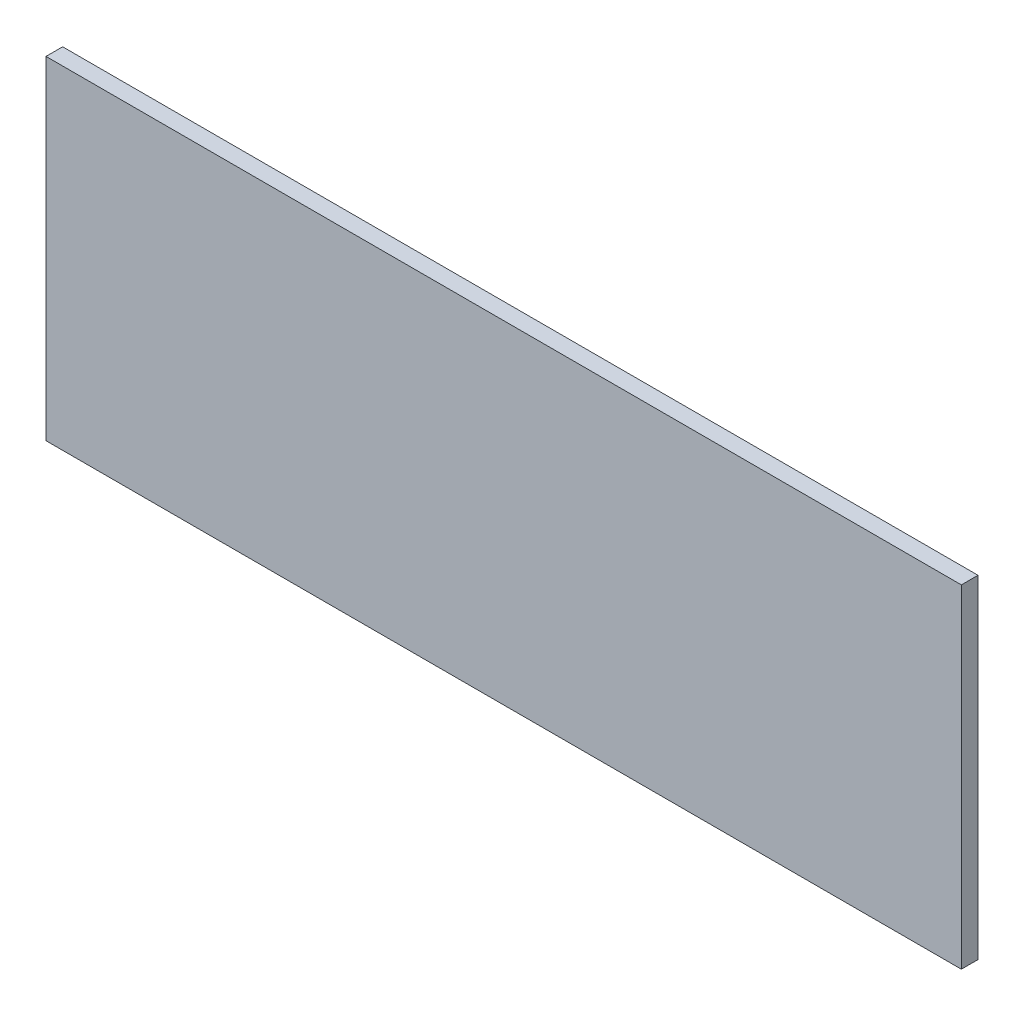
ISO-10303-21;
HEADER;
FILE_DESCRIPTION(('STEP AP214'),'2;1');
FILE_NAME('part.step','',(''),(''),'','','');
FILE_SCHEMA(('AUTOMOTIVE_DESIGN { 1 0 10303 214 1 1 1 1 }'));
ENDSEC;
DATA;
#1=APPLICATION_CONTEXT('core data for automotive mechanical design processes');
#2=APPLICATION_PROTOCOL_DEFINITION('international standard','automotive_design',2000,#1);
#3=PRODUCT_CONTEXT('',#1,'mechanical');
#4=PRODUCT('Part','Part','',(#3));
#5=PRODUCT_RELATED_PRODUCT_CATEGORY('part','',(#4));
#6=PRODUCT_DEFINITION_FORMATION('','',#4);
#7=PRODUCT_DEFINITION_CONTEXT('part definition',#1,'design');
#8=PRODUCT_DEFINITION('design','',#6,#7);
#9=PRODUCT_DEFINITION_SHAPE('','',#8);
#10=(LENGTH_UNIT() NAMED_UNIT(*) SI_UNIT(.MILLI.,.METRE.));
#11=(NAMED_UNIT(*) PLANE_ANGLE_UNIT() SI_UNIT($,.RADIAN.));
#12=(NAMED_UNIT(*) SI_UNIT($,.STERADIAN.) SOLID_ANGLE_UNIT());
#13=UNCERTAINTY_MEASURE_WITH_UNIT(LENGTH_MEASURE(1.E-05),#10,'distance_accuracy_value','');
#14=(GEOMETRIC_REPRESENTATION_CONTEXT(3) GLOBAL_UNCERTAINTY_ASSIGNED_CONTEXT((#13)) GLOBAL_UNIT_ASSIGNED_CONTEXT((#10,
#11,#12)) REPRESENTATION_CONTEXT('',''));
#15=CARTESIAN_POINT('',(0.,0.,0.));
#16=DIRECTION('',(0.,0.,1.));
#17=DIRECTION('',(1.,0.,0.));
#18=AXIS2_PLACEMENT_3D('',#15,#16,#17);
#19=CARTESIAN_POINT('',(-165.,-60.,6.));
#20=DIRECTION('',(1.,0.,0.));
#21=DIRECTION('',(0.,0.,-1.));
#22=AXIS2_PLACEMENT_3D('',#19,#20,#21);
#23=PLANE('',#22);
#24=DIRECTION('',(0.,-1.,0.));
#25=VECTOR('',#24,1.);
#26=CARTESIAN_POINT('',(-165.,-60.,0.));
#27=LINE('',#26,#25);
#28=CARTESIAN_POINT('',(-165.,60.,0.));
#29=VERTEX_POINT('',#28);
#30=CARTESIAN_POINT('',(-165.,-60.,0.));
#31=VERTEX_POINT('',#30);
#32=EDGE_CURVE('E96',#29,#31,#27,.T.);
#33=ORIENTED_EDGE('',*,*,#32,.T.);
#34=DIRECTION('',(0.,0.,-1.));
#35=VECTOR('',#34,1.);
#36=CARTESIAN_POINT('',(-165.,-60.,6.));
#37=LINE('',#36,#35);
#38=CARTESIAN_POINT('',(-165.,-60.,6.));
#39=VERTEX_POINT('',#38);
#40=EDGE_CURVE('E11',#39,#31,#37,.T.);
#41=ORIENTED_EDGE('',*,*,#40,.F.);
#42=DIRECTION('',(0.,-1.,0.));
#43=VECTOR('',#42,1.);
#44=CARTESIAN_POINT('',(-165.,-60.,6.));
#45=LINE('',#44,#43);
#46=CARTESIAN_POINT('',(-165.,60.,6.));
#47=VERTEX_POINT('',#46);
#48=EDGE_CURVE('E84',#47,#39,#45,.T.);
#49=ORIENTED_EDGE('',*,*,#48,.F.);
#50=DIRECTION('',(0.,0.,-1.));
#51=VECTOR('',#50,1.);
#52=CARTESIAN_POINT('',(-165.,60.,6.));
#53=LINE('',#52,#51);
#54=EDGE_CURVE('E92',#47,#29,#53,.T.);
#55=ORIENTED_EDGE('',*,*,#54,.T.);
#56=EDGE_LOOP('',(#33,#41,#49,#55));
#57=FACE_BOUND('',#56,.T.);
#58=ADVANCED_FACE('F33',(#57),#23,.F.);
#59=CARTESIAN_POINT('',(165.,-60.,6.));
#60=DIRECTION('',(0.,1.,0.));
#61=DIRECTION('',(-1.,0.,0.));
#62=AXIS2_PLACEMENT_3D('',#59,#60,#61);
#63=PLANE('',#62);
#64=DIRECTION('',(1.,0.,0.));
#65=VECTOR('',#64,1.);
#66=CARTESIAN_POINT('',(165.,-60.,0.));
#67=LINE('',#66,#65);
#68=CARTESIAN_POINT('',(165.,-60.,0.));
#69=VERTEX_POINT('',#68);
#70=EDGE_CURVE('E88',#31,#69,#67,.T.);
#71=ORIENTED_EDGE('',*,*,#70,.T.);
#72=DIRECTION('',(0.,0.,-1.));
#73=VECTOR('',#72,1.);
#74=CARTESIAN_POINT('',(165.,-60.,6.));
#75=LINE('',#74,#73);
#76=CARTESIAN_POINT('',(165.,-60.,6.));
#77=VERTEX_POINT('',#76);
#78=EDGE_CURVE('E41',#77,#69,#75,.T.);
#79=ORIENTED_EDGE('',*,*,#78,.F.);
#80=DIRECTION('',(1.,0.,0.));
#81=VECTOR('',#80,1.);
#82=CARTESIAN_POINT('',(165.,-60.,6.));
#83=LINE('',#82,#81);
#84=EDGE_CURVE('E79',#39,#77,#83,.T.);
#85=ORIENTED_EDGE('',*,*,#84,.F.);
#86=ORIENTED_EDGE('',*,*,#40,.T.);
#87=EDGE_LOOP('',(#71,#79,#85,#86));
#88=FACE_BOUND('',#87,.T.);
#89=ADVANCED_FACE('F87',(#88),#63,.F.);
#90=CARTESIAN_POINT('',(165.,-60.,6.));
#91=DIRECTION('',(-1.,0.,0.));
#92=DIRECTION('',(0.,0.,1.));
#93=AXIS2_PLACEMENT_3D('',#90,#91,#92);
#94=PLANE('',#93);
#95=DIRECTION('',(0.,1.,0.));
#96=VECTOR('',#95,1.);
#97=CARTESIAN_POINT('',(165.,-60.,0.));
#98=LINE('',#97,#96);
#99=CARTESIAN_POINT('',(165.,60.,0.));
#100=VERTEX_POINT('',#99);
#101=EDGE_CURVE('E66',#69,#100,#98,.T.);
#102=ORIENTED_EDGE('',*,*,#101,.T.);
#103=DIRECTION('',(0.,0.,-1.));
#104=VECTOR('',#103,1.);
#105=CARTESIAN_POINT('',(165.,60.,6.));
#106=LINE('',#105,#104);
#107=CARTESIAN_POINT('',(165.,60.,6.));
#108=VERTEX_POINT('',#107);
#109=EDGE_CURVE('E89',#108,#100,#106,.T.);
#110=ORIENTED_EDGE('',*,*,#109,.F.);
#111=DIRECTION('',(0.,1.,0.));
#112=VECTOR('',#111,1.);
#113=CARTESIAN_POINT('',(165.,-60.,6.));
#114=LINE('',#113,#112);
#115=EDGE_CURVE('E82',#77,#108,#114,.T.);
#116=ORIENTED_EDGE('',*,*,#115,.F.);
#117=ORIENTED_EDGE('',*,*,#78,.T.);
#118=EDGE_LOOP('',(#102,#110,#116,#117));
#119=FACE_BOUND('',#118,.T.);
#120=ADVANCED_FACE('F90',(#119),#94,.F.);
#121=CARTESIAN_POINT('',(165.,60.,6.));
#122=DIRECTION('',(0.,-1.,0.));
#123=DIRECTION('',(1.,0.,0.));
#124=AXIS2_PLACEMENT_3D('',#121,#122,#123);
#125=PLANE('',#124);
#126=DIRECTION('',(-1.,0.,0.));
#127=VECTOR('',#126,1.);
#128=CARTESIAN_POINT('',(165.,60.,0.));
#129=LINE('',#128,#127);
#130=EDGE_CURVE('E72',#100,#29,#129,.T.);
#131=ORIENTED_EDGE('',*,*,#130,.T.);
#132=ORIENTED_EDGE('',*,*,#54,.F.);
#133=DIRECTION('',(-1.,0.,0.));
#134=VECTOR('',#133,1.);
#135=CARTESIAN_POINT('',(165.,60.,6.));
#136=LINE('',#135,#134);
#137=EDGE_CURVE('E49',#108,#47,#136,.T.);
#138=ORIENTED_EDGE('',*,*,#137,.F.);
#139=ORIENTED_EDGE('',*,*,#109,.T.);
#140=EDGE_LOOP('',(#131,#132,#138,#139));
#141=FACE_BOUND('',#140,.T.);
#142=ADVANCED_FACE('F103',(#141),#125,.F.);
#143=CARTESIAN_POINT('',(0.,0.,6.));
#144=DIRECTION('',(0.,0.,1.));
#145=DIRECTION('',(1.,0.,0.));
#146=AXIS2_PLACEMENT_3D('',#143,#144,#145);
#147=PLANE('',#146);
#148=ORIENTED_EDGE('',*,*,#48,.T.);
#149=ORIENTED_EDGE('',*,*,#84,.T.);
#150=ORIENTED_EDGE('',*,*,#115,.T.);
#151=ORIENTED_EDGE('',*,*,#137,.T.);
#152=EDGE_LOOP('',(#148,#149,#150,#151));
#153=FACE_BOUND('',#152,.T.);
#154=ADVANCED_FACE('F80',(#153),#147,.T.);
#155=CARTESIAN_POINT('',(0.,0.,0.));
#156=DIRECTION('',(0.,0.,1.));
#157=DIRECTION('',(1.,0.,0.));
#158=AXIS2_PLACEMENT_3D('',#155,#156,#157);
#159=PLANE('',#158);
#160=ORIENTED_EDGE('',*,*,#32,.F.);
#161=ORIENTED_EDGE('',*,*,#130,.F.);
#162=ORIENTED_EDGE('',*,*,#101,.F.);
#163=ORIENTED_EDGE('',*,*,#70,.F.);
#164=EDGE_LOOP('',(#160,#161,#162,#163));
#165=FACE_BOUND('',#164,.T.);
#166=ADVANCED_FACE('F106',(#165),#159,.F.);
#167=CLOSED_SHELL('',(#58,#89,#120,#142,#154,#166));
#168=MANIFOLD_SOLID_BREP('B2',#167);
#169=ADVANCED_BREP_SHAPE_REPRESENTATION('',(#18,#168),#14);
#170=SHAPE_DEFINITION_REPRESENTATION(#9,#169);
ENDSEC;
END-ISO-10303-21;
